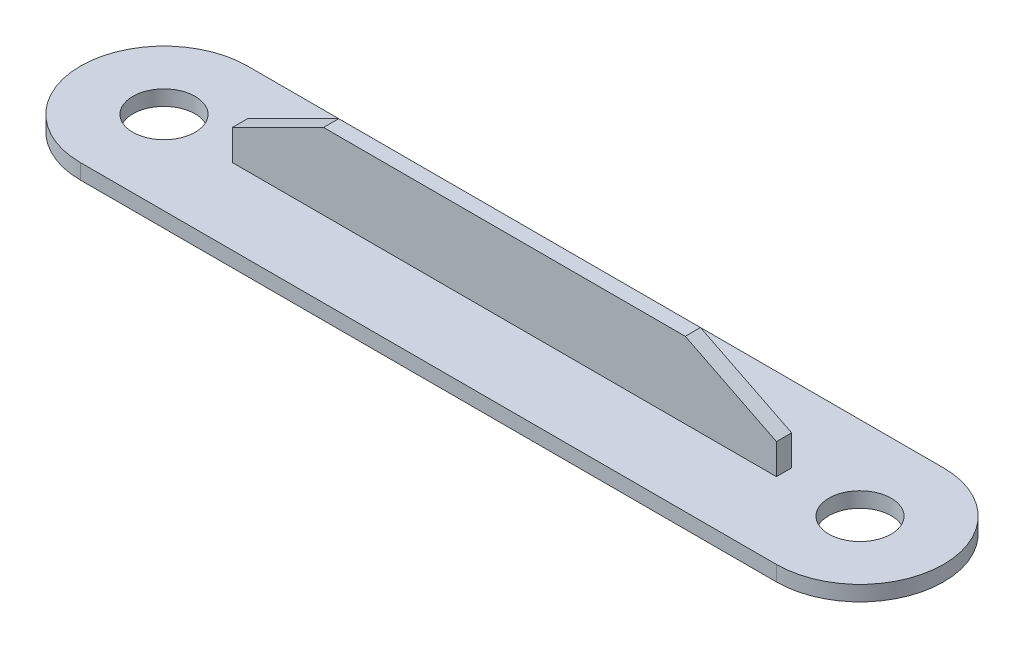
ISO-10303-21;
HEADER;
FILE_DESCRIPTION(('STEP AP214'),'2;1');
FILE_NAME('part.step','',(''),(''),'','','');
FILE_SCHEMA(('AUTOMOTIVE_DESIGN { 1 0 10303 214 1 1 1 1 }'));
ENDSEC;
DATA;
#1=APPLICATION_CONTEXT('core data for automotive mechanical design processes');
#2=APPLICATION_PROTOCOL_DEFINITION('international standard','automotive_design',2000,#1);
#3=PRODUCT_CONTEXT('',#1,'mechanical');
#4=PRODUCT('Part','Part','',(#3));
#5=PRODUCT_RELATED_PRODUCT_CATEGORY('part','',(#4));
#6=PRODUCT_DEFINITION_FORMATION('','',#4);
#7=PRODUCT_DEFINITION_CONTEXT('part definition',#1,'design');
#8=PRODUCT_DEFINITION('design','',#6,#7);
#9=PRODUCT_DEFINITION_SHAPE('','',#8);
#10=(LENGTH_UNIT() NAMED_UNIT(*) SI_UNIT(.MILLI.,.METRE.));
#11=(NAMED_UNIT(*) PLANE_ANGLE_UNIT() SI_UNIT($,.RADIAN.));
#12=(NAMED_UNIT(*) SI_UNIT($,.STERADIAN.) SOLID_ANGLE_UNIT());
#13=UNCERTAINTY_MEASURE_WITH_UNIT(LENGTH_MEASURE(1.E-05),#10,'distance_accuracy_value','');
#14=(GEOMETRIC_REPRESENTATION_CONTEXT(3) GLOBAL_UNCERTAINTY_ASSIGNED_CONTEXT((#13)) GLOBAL_UNIT_ASSIGNED_CONTEXT((#10,
#11,#12)) REPRESENTATION_CONTEXT('',''));
#15=CARTESIAN_POINT('',(0.,0.,0.));
#16=DIRECTION('',(0.,0.,1.));
#17=DIRECTION('',(1.,0.,0.));
#18=AXIS2_PLACEMENT_3D('',#15,#16,#17);
#19=CARTESIAN_POINT('',(-229.,10.,0.));
#20=DIRECTION('',(0.,1.,0.));
#21=DIRECTION('',(0.,0.,1.));
#22=AXIS2_PLACEMENT_3D('',#19,#20,#21);
#23=PLANE('',#22);
#24=CARTESIAN_POINT('',(229.,10.,0.));
#25=DIRECTION('',(0.,1.,0.));
#26=DIRECTION('',(0.,0.,1.));
#27=AXIS2_PLACEMENT_3D('',#24,#25,#26);
#28=CIRCLE('',#27,20.5);
#29=CARTESIAN_POINT('',(229.,10.,20.5));
#30=VERTEX_POINT('',#29);
#31=EDGE_CURVE('E151',#30,#30,#28,.T.);
#32=ORIENTED_EDGE('',*,*,#31,.F.);
#33=EDGE_LOOP('',(#32));
#34=FACE_BOUND('',#33,.T.);
#35=CARTESIAN_POINT('',(-229.,10.,0.));
#36=DIRECTION('',(0.,1.,0.));
#37=DIRECTION('',(0.,0.,1.));
#38=AXIS2_PLACEMENT_3D('',#35,#36,#37);
#39=CIRCLE('',#38,55.);
#40=CARTESIAN_POINT('',(-229.,10.,-55.));
#41=VERTEX_POINT('',#40);
#42=CARTESIAN_POINT('',(-229.,10.,55.));
#43=VERTEX_POINT('',#42);
#44=EDGE_CURVE('E163',#41,#43,#39,.T.);
#45=ORIENTED_EDGE('',*,*,#44,.T.);
#46=DIRECTION('',(1.,0.,0.));
#47=VECTOR('',#46,1.);
#48=CARTESIAN_POINT('',(-229.,10.,55.));
#49=LINE('',#48,#47);
#50=CARTESIAN_POINT('',(229.,10.,55.));
#51=VERTEX_POINT('',#50);
#52=EDGE_CURVE('E166',#43,#51,#49,.T.);
#53=ORIENTED_EDGE('',*,*,#52,.T.);
#54=CARTESIAN_POINT('',(229.,10.,0.));
#55=DIRECTION('',(0.,1.,0.));
#56=DIRECTION('',(0.,0.,-1.));
#57=AXIS2_PLACEMENT_3D('',#54,#55,#56);
#58=CIRCLE('',#57,55.);
#59=CARTESIAN_POINT('',(229.,10.,-55.));
#60=VERTEX_POINT('',#59);
#61=EDGE_CURVE('E169',#51,#60,#58,.T.);
#62=ORIENTED_EDGE('',*,*,#61,.T.);
#63=DIRECTION('',(-1.,0.,0.));
#64=VECTOR('',#63,1.);
#65=CARTESIAN_POINT('',(-229.,10.,-55.));
#66=LINE('',#65,#64);
#67=EDGE_CURVE('E171',#60,#41,#66,.T.);
#68=ORIENTED_EDGE('',*,*,#67,.T.);
#69=EDGE_LOOP('',(#45,#53,#62,#68));
#70=FACE_BOUND('',#69,.T.);
#71=CARTESIAN_POINT('',(-229.,10.,0.));
#72=DIRECTION('',(0.,1.,0.));
#73=DIRECTION('',(0.,0.,1.));
#74=AXIS2_PLACEMENT_3D('',#71,#72,#73);
#75=CIRCLE('',#74,20.5);
#76=CARTESIAN_POINT('',(-229.,10.,20.5));
#77=VERTEX_POINT('',#76);
#78=EDGE_CURVE('E157',#77,#77,#75,.T.);
#79=ORIENTED_EDGE('',*,*,#78,.F.);
#80=EDGE_LOOP('',(#79));
#81=FACE_BOUND('',#80,.T.);
#82=DIRECTION('',(1.,0.,0.));
#83=VECTOR('',#82,1.);
#84=CARTESIAN_POINT('',(-179.,10.,5.));
#85=LINE('',#84,#83);
#86=CARTESIAN_POINT('',(-179.,10.,5.));
#87=VERTEX_POINT('',#86);
#88=CARTESIAN_POINT('',(179.,10.,4.99999999999998));
#89=VERTEX_POINT('',#88);
#90=EDGE_CURVE('E140',#87,#89,#85,.T.);
#91=ORIENTED_EDGE('',*,*,#90,.F.);
#92=DIRECTION('',(0.,0.,1.));
#93=VECTOR('',#92,1.);
#94=CARTESIAN_POINT('',(-179.,10.,-5.));
#95=LINE('',#94,#93);
#96=CARTESIAN_POINT('',(-179.,10.,-5.));
#97=VERTEX_POINT('',#96);
#98=EDGE_CURVE('E137',#97,#87,#95,.T.);
#99=ORIENTED_EDGE('',*,*,#98,.F.);
#100=DIRECTION('',(-1.,0.,0.));
#101=VECTOR('',#100,1.);
#102=CARTESIAN_POINT('',(-179.,10.,-5.));
#103=LINE('',#102,#101);
#104=CARTESIAN_POINT('',(179.,10.,-4.99999999999998));
#105=VERTEX_POINT('',#104);
#106=EDGE_CURVE('E126',#105,#97,#103,.T.);
#107=ORIENTED_EDGE('',*,*,#106,.F.);
#108=DIRECTION('',(0.,0.,-1.));
#109=VECTOR('',#108,1.);
#110=CARTESIAN_POINT('',(179.,10.,-4.99999999999998));
#111=LINE('',#110,#109);
#112=EDGE_CURVE('E131',#89,#105,#111,.T.);
#113=ORIENTED_EDGE('',*,*,#112,.F.);
#114=EDGE_LOOP('',(#91,#99,#107,#113));
#115=FACE_BOUND('',#114,.T.);
#116=ADVANCED_FACE('F34',(#34,#70,#81,#115),#23,.T.);
#117=CARTESIAN_POINT('',(-229.,0.,0.));
#118=DIRECTION('',(0.,1.,0.));
#119=DIRECTION('',(0.,0.,1.));
#120=AXIS2_PLACEMENT_3D('',#117,#118,#119);
#121=PLANE('',#120);
#122=CARTESIAN_POINT('',(-229.,0.,0.));
#123=DIRECTION('',(0.,1.,0.));
#124=DIRECTION('',(0.,0.,1.));
#125=AXIS2_PLACEMENT_3D('',#122,#123,#124);
#126=CIRCLE('',#125,20.5);
#127=CARTESIAN_POINT('',(-229.,0.,20.5));
#128=VERTEX_POINT('',#127);
#129=EDGE_CURVE('E154',#128,#128,#126,.T.);
#130=ORIENTED_EDGE('',*,*,#129,.T.);
#131=EDGE_LOOP('',(#130));
#132=FACE_BOUND('',#131,.T.);
#133=CARTESIAN_POINT('',(-229.,0.,0.));
#134=DIRECTION('',(0.,1.,0.));
#135=DIRECTION('',(0.,0.,1.));
#136=AXIS2_PLACEMENT_3D('',#133,#134,#135);
#137=CIRCLE('',#136,55.);
#138=CARTESIAN_POINT('',(-229.,0.,-55.));
#139=VERTEX_POINT('',#138);
#140=CARTESIAN_POINT('',(-229.,0.,55.));
#141=VERTEX_POINT('',#140);
#142=EDGE_CURVE('E160',#139,#141,#137,.T.);
#143=ORIENTED_EDGE('',*,*,#142,.F.);
#144=DIRECTION('',(-1.,0.,0.));
#145=VECTOR('',#144,1.);
#146=CARTESIAN_POINT('',(-229.,0.,-55.));
#147=LINE('',#146,#145);
#148=CARTESIAN_POINT('',(229.,0.,-55.));
#149=VERTEX_POINT('',#148);
#150=EDGE_CURVE('E167',#149,#139,#147,.T.);
#151=ORIENTED_EDGE('',*,*,#150,.F.);
#152=CARTESIAN_POINT('',(229.,0.,0.));
#153=DIRECTION('',(0.,1.,0.));
#154=DIRECTION('',(0.,0.,-1.));
#155=AXIS2_PLACEMENT_3D('',#152,#153,#154);
#156=CIRCLE('',#155,55.);
#157=CARTESIAN_POINT('',(229.,0.,55.));
#158=VERTEX_POINT('',#157);
#159=EDGE_CURVE('E178',#158,#149,#156,.T.);
#160=ORIENTED_EDGE('',*,*,#159,.F.);
#161=DIRECTION('',(1.,0.,0.));
#162=VECTOR('',#161,1.);
#163=CARTESIAN_POINT('',(-229.,0.,55.));
#164=LINE('',#163,#162);
#165=EDGE_CURVE('E176',#141,#158,#164,.T.);
#166=ORIENTED_EDGE('',*,*,#165,.F.);
#167=EDGE_LOOP('',(#143,#151,#160,#166));
#168=FACE_BOUND('',#167,.T.);
#169=CARTESIAN_POINT('',(229.,0.,0.));
#170=DIRECTION('',(0.,1.,0.));
#171=DIRECTION('',(0.,0.,1.));
#172=AXIS2_PLACEMENT_3D('',#169,#170,#171);
#173=CIRCLE('',#172,20.5);
#174=CARTESIAN_POINT('',(229.,0.,20.5));
#175=VERTEX_POINT('',#174);
#176=EDGE_CURVE('E150',#175,#175,#173,.T.);
#177=ORIENTED_EDGE('',*,*,#176,.T.);
#178=EDGE_LOOP('',(#177));
#179=FACE_BOUND('',#178,.T.);
#180=ADVANCED_FACE('F224',(#132,#168,#179),#121,.F.);
#181=CARTESIAN_POINT('',(-229.,10.,0.));
#182=DIRECTION('',(0.,-1.,0.));
#183=DIRECTION('',(0.,0.,-1.));
#184=AXIS2_PLACEMENT_3D('',#181,#182,#183);
#185=CYLINDRICAL_SURFACE('',#184,55.);
#186=ORIENTED_EDGE('',*,*,#142,.T.);
#187=DIRECTION('',(0.,-1.,0.));
#188=VECTOR('',#187,1.);
#189=CARTESIAN_POINT('',(-229.,10.,55.));
#190=LINE('',#189,#188);
#191=EDGE_CURVE('E189',#43,#141,#190,.T.);
#192=ORIENTED_EDGE('',*,*,#191,.F.);
#193=ORIENTED_EDGE('',*,*,#44,.F.);
#194=DIRECTION('',(0.,-1.,0.));
#195=VECTOR('',#194,1.);
#196=CARTESIAN_POINT('',(-229.,10.,-55.));
#197=LINE('',#196,#195);
#198=EDGE_CURVE('E173',#41,#139,#197,.T.);
#199=ORIENTED_EDGE('',*,*,#198,.T.);
#200=EDGE_LOOP('',(#186,#192,#193,#199));
#201=FACE_BOUND('',#200,.T.);
#202=ADVANCED_FACE('F36',(#201),#185,.T.);
#203=CARTESIAN_POINT('',(-229.,10.,55.));
#204=DIRECTION('',(0.,0.,-1.));
#205=DIRECTION('',(-1.,0.,0.));
#206=AXIS2_PLACEMENT_3D('',#203,#204,#205);
#207=PLANE('',#206);
#208=ORIENTED_EDGE('',*,*,#165,.T.);
#209=DIRECTION('',(0.,-1.,0.));
#210=VECTOR('',#209,1.);
#211=CARTESIAN_POINT('',(229.,10.,55.));
#212=LINE('',#211,#210);
#213=EDGE_CURVE('E186',#51,#158,#212,.T.);
#214=ORIENTED_EDGE('',*,*,#213,.F.);
#215=ORIENTED_EDGE('',*,*,#52,.F.);
#216=ORIENTED_EDGE('',*,*,#191,.T.);
#217=EDGE_LOOP('',(#208,#214,#215,#216));
#218=FACE_BOUND('',#217,.T.);
#219=ADVANCED_FACE('F242',(#218),#207,.F.);
#220=CARTESIAN_POINT('',(229.,10.,0.));
#221=DIRECTION('',(0.,-1.,0.));
#222=DIRECTION('',(0.,0.,-1.));
#223=AXIS2_PLACEMENT_3D('',#220,#221,#222);
#224=CYLINDRICAL_SURFACE('',#223,55.);
#225=ORIENTED_EDGE('',*,*,#159,.T.);
#226=DIRECTION('',(0.,-1.,0.));
#227=VECTOR('',#226,1.);
#228=CARTESIAN_POINT('',(229.,10.,-55.));
#229=LINE('',#228,#227);
#230=EDGE_CURVE('E183',#60,#149,#229,.T.);
#231=ORIENTED_EDGE('',*,*,#230,.F.);
#232=ORIENTED_EDGE('',*,*,#61,.F.);
#233=ORIENTED_EDGE('',*,*,#213,.T.);
#234=EDGE_LOOP('',(#225,#231,#232,#233));
#235=FACE_BOUND('',#234,.T.);
#236=ADVANCED_FACE('F239',(#235),#224,.T.);
#237=CARTESIAN_POINT('',(-229.,10.,-55.));
#238=DIRECTION('',(0.,0.,1.));
#239=DIRECTION('',(1.,0.,0.));
#240=AXIS2_PLACEMENT_3D('',#237,#238,#239);
#241=PLANE('',#240);
#242=ORIENTED_EDGE('',*,*,#150,.T.);
#243=ORIENTED_EDGE('',*,*,#198,.F.);
#244=ORIENTED_EDGE('',*,*,#67,.F.);
#245=ORIENTED_EDGE('',*,*,#230,.T.);
#246=EDGE_LOOP('',(#242,#243,#244,#245));
#247=FACE_BOUND('',#246,.T.);
#248=ADVANCED_FACE('F236',(#247),#241,.F.);
#249=CARTESIAN_POINT('',(-229.,10.,0.));
#250=DIRECTION('',(0.,-1.,0.));
#251=DIRECTION('',(0.,0.,-1.));
#252=AXIS2_PLACEMENT_3D('',#249,#250,#251);
#253=CYLINDRICAL_SURFACE('',#252,20.5);
#254=ORIENTED_EDGE('',*,*,#78,.T.);
#255=EDGE_LOOP('',(#254));
#256=FACE_BOUND('',#255,.T.);
#257=ORIENTED_EDGE('',*,*,#129,.F.);
#258=EDGE_LOOP('',(#257));
#259=FACE_BOUND('',#258,.T.);
#260=ADVANCED_FACE('F220',(#256,#259),#253,.F.);
#261=CARTESIAN_POINT('',(229.,10.,0.));
#262=DIRECTION('',(0.,-1.,0.));
#263=DIRECTION('',(0.,0.,-1.));
#264=AXIS2_PLACEMENT_3D('',#261,#262,#263);
#265=CYLINDRICAL_SURFACE('',#264,20.5);
#266=ORIENTED_EDGE('',*,*,#31,.T.);
#267=EDGE_LOOP('',(#266));
#268=FACE_BOUND('',#267,.T.);
#269=ORIENTED_EDGE('',*,*,#176,.F.);
#270=EDGE_LOOP('',(#269));
#271=FACE_BOUND('',#270,.T.);
#272=ADVANCED_FACE('F213',(#268,#271),#265,.F.);
#273=CARTESIAN_POINT('',(-179.,60.,-5.));
#274=DIRECTION('',(1.,0.,0.));
#275=DIRECTION('',(0.,0.,-1.));
#276=AXIS2_PLACEMENT_3D('',#273,#274,#275);
#277=PLANE('',#276);
#278=DIRECTION('',(0.,-1.,0.));
#279=VECTOR('',#278,1.);
#280=CARTESIAN_POINT('',(-179.,60.,5.));
#281=LINE('',#280,#279);
#282=CARTESIAN_POINT('',(-179.,30.,4.99999999999999));
#283=VERTEX_POINT('',#282);
#284=EDGE_CURVE('E148',#283,#87,#281,.T.);
#285=ORIENTED_EDGE('',*,*,#284,.F.);
#286=DIRECTION('',(0.,0.,1.));
#287=VECTOR('',#286,1.);
#288=CARTESIAN_POINT('',(-179.,30.,-55.));
#289=LINE('',#288,#287);
#290=CARTESIAN_POINT('',(-179.,30.,-5.00000000000001));
#291=VERTEX_POINT('',#290);
#292=EDGE_CURVE('E197',#291,#283,#289,.T.);
#293=ORIENTED_EDGE('',*,*,#292,.F.);
#294=DIRECTION('',(0.,-1.,0.));
#295=VECTOR('',#294,1.);
#296=CARTESIAN_POINT('',(-179.,60.,-5.));
#297=LINE('',#296,#295);
#298=EDGE_CURVE('E128',#291,#97,#297,.T.);
#299=ORIENTED_EDGE('',*,*,#298,.T.);
#300=ORIENTED_EDGE('',*,*,#98,.T.);
#301=EDGE_LOOP('',(#285,#293,#299,#300));
#302=FACE_BOUND('',#301,.T.);
#303=ADVANCED_FACE('F211',(#302),#277,.F.);
#304=CARTESIAN_POINT('',(-179.,60.,5.));
#305=DIRECTION('',(0.,0.,-1.));
#306=DIRECTION('',(-1.,0.,0.));
#307=AXIS2_PLACEMENT_3D('',#304,#305,#306);
#308=PLANE('',#307);
#309=DIRECTION('',(0.,-1.,0.));
#310=VECTOR('',#309,1.);
#311=CARTESIAN_POINT('',(179.,60.,4.99999999999998));
#312=LINE('',#311,#310);
#313=CARTESIAN_POINT('',(179.,30.,4.99999999999999));
#314=VERTEX_POINT('',#313);
#315=EDGE_CURVE('E121',#314,#89,#312,.T.);
#316=ORIENTED_EDGE('',*,*,#315,.F.);
#317=DIRECTION('',(0.894427190999916,-0.447213595499958,0.));
#318=VECTOR('',#317,1.);
#319=CARTESIAN_POINT('',(179.,30.,4.99999999999999));
#320=LINE('',#319,#318);
#321=CARTESIAN_POINT('',(119.,60.,4.99999999999999));
#322=VERTEX_POINT('',#321);
#323=EDGE_CURVE('E110',#322,#314,#320,.T.);
#324=ORIENTED_EDGE('',*,*,#323,.F.);
#325=DIRECTION('',(1.,0.,0.));
#326=VECTOR('',#325,1.);
#327=CARTESIAN_POINT('',(-179.,60.,5.));
#328=LINE('',#327,#326);
#329=CARTESIAN_POINT('',(-119.,60.,5.));
#330=VERTEX_POINT('',#329);
#331=EDGE_CURVE('E119',#330,#322,#328,.T.);
#332=ORIENTED_EDGE('',*,*,#331,.F.);
#333=DIRECTION('',(0.894427190999916,0.447213595499958,0.));
#334=VECTOR('',#333,1.);
#335=CARTESIAN_POINT('',(-179.,30.,4.99999999999999));
#336=LINE('',#335,#334);
#337=EDGE_CURVE('E56',#283,#330,#336,.T.);
#338=ORIENTED_EDGE('',*,*,#337,.F.);
#339=ORIENTED_EDGE('',*,*,#284,.T.);
#340=ORIENTED_EDGE('',*,*,#90,.T.);
#341=EDGE_LOOP('',(#316,#324,#332,#338,#339,#340));
#342=FACE_BOUND('',#341,.T.);
#343=ADVANCED_FACE('F118',(#342),#308,.F.);
#344=CARTESIAN_POINT('',(179.,60.,-4.99999999999998));
#345=DIRECTION('',(-1.,0.,0.));
#346=DIRECTION('',(0.,0.,1.));
#347=AXIS2_PLACEMENT_3D('',#344,#345,#346);
#348=PLANE('',#347);
#349=DIRECTION('',(0.,-1.,0.));
#350=VECTOR('',#349,1.);
#351=CARTESIAN_POINT('',(179.,60.,-4.99999999999998));
#352=LINE('',#351,#350);
#353=CARTESIAN_POINT('',(179.,30.,-5.));
#354=VERTEX_POINT('',#353);
#355=EDGE_CURVE('E145',#354,#105,#352,.T.);
#356=ORIENTED_EDGE('',*,*,#355,.F.);
#357=DIRECTION('',(0.,0.,1.));
#358=VECTOR('',#357,1.);
#359=CARTESIAN_POINT('',(179.,30.,-55.));
#360=LINE('',#359,#358);
#361=EDGE_CURVE('E122',#354,#314,#360,.T.);
#362=ORIENTED_EDGE('',*,*,#361,.T.);
#363=ORIENTED_EDGE('',*,*,#315,.T.);
#364=ORIENTED_EDGE('',*,*,#112,.T.);
#365=EDGE_LOOP('',(#356,#362,#363,#364));
#366=FACE_BOUND('',#365,.T.);
#367=ADVANCED_FACE('F203',(#366),#348,.F.);
#368=CARTESIAN_POINT('',(-179.,60.,-5.));
#369=DIRECTION('',(0.,0.,1.));
#370=DIRECTION('',(1.,0.,0.));
#371=AXIS2_PLACEMENT_3D('',#368,#369,#370);
#372=PLANE('',#371);
#373=DIRECTION('',(-1.,0.,0.));
#374=VECTOR('',#373,1.);
#375=CARTESIAN_POINT('',(-179.,60.,-5.));
#376=LINE('',#375,#374);
#377=CARTESIAN_POINT('',(119.,60.,-4.99999999999998));
#378=VERTEX_POINT('',#377);
#379=CARTESIAN_POINT('',(-119.,60.,-5.00000000000001));
#380=VERTEX_POINT('',#379);
#381=EDGE_CURVE('E125',#378,#380,#376,.T.);
#382=ORIENTED_EDGE('',*,*,#381,.F.);
#383=DIRECTION('',(0.894427190999916,-0.447213595499958,0.));
#384=VECTOR('',#383,1.);
#385=CARTESIAN_POINT('',(-119.4,179.2,-5.));
#386=LINE('',#385,#384);
#387=EDGE_CURVE('E48',#378,#354,#386,.T.);
#388=ORIENTED_EDGE('',*,*,#387,.T.);
#389=ORIENTED_EDGE('',*,*,#355,.T.);
#390=ORIENTED_EDGE('',*,*,#106,.T.);
#391=ORIENTED_EDGE('',*,*,#298,.F.);
#392=DIRECTION('',(0.894427190999916,0.447213595499958,0.));
#393=VECTOR('',#392,1.);
#394=CARTESIAN_POINT('',(-167.,36.,-5.));
#395=LINE('',#394,#393);
#396=EDGE_CURVE('E134',#291,#380,#395,.T.);
#397=ORIENTED_EDGE('',*,*,#396,.T.);
#398=EDGE_LOOP('',(#382,#388,#389,#390,#391,#397));
#399=FACE_BOUND('',#398,.T.);
#400=ADVANCED_FACE('F196',(#399),#372,.F.);
#401=CARTESIAN_POINT('',(0.,60.,0.));
#402=DIRECTION('',(0.,1.,0.));
#403=DIRECTION('',(0.,0.,1.));
#404=AXIS2_PLACEMENT_3D('',#401,#402,#403);
#405=PLANE('',#404);
#406=DIRECTION('',(0.,0.,1.));
#407=VECTOR('',#406,1.);
#408=CARTESIAN_POINT('',(119.,60.,0.));
#409=LINE('',#408,#407);
#410=EDGE_CURVE('E11',#378,#322,#409,.T.);
#411=ORIENTED_EDGE('',*,*,#410,.F.);
#412=ORIENTED_EDGE('',*,*,#381,.T.);
#413=DIRECTION('',(0.,0.,-1.));
#414=VECTOR('',#413,1.);
#415=CARTESIAN_POINT('',(-119.,60.,0.));
#416=LINE('',#415,#414);
#417=EDGE_CURVE('E42',#330,#380,#416,.T.);
#418=ORIENTED_EDGE('',*,*,#417,.F.);
#419=ORIENTED_EDGE('',*,*,#331,.T.);
#420=EDGE_LOOP('',(#411,#412,#418,#419));
#421=FACE_BOUND('',#420,.T.);
#422=ADVANCED_FACE('F124',(#421),#405,.T.);
#423=CARTESIAN_POINT('',(-179.,30.,-55.));
#424=DIRECTION('',(0.447213595499958,-0.894427190999916,0.));
#425=DIRECTION('',(0.894427190999916,0.447213595499958,0.));
#426=AXIS2_PLACEMENT_3D('',#423,#424,#425);
#427=PLANE('',#426);
#428=ORIENTED_EDGE('',*,*,#292,.T.);
#429=ORIENTED_EDGE('',*,*,#337,.T.);
#430=ORIENTED_EDGE('',*,*,#417,.T.);
#431=ORIENTED_EDGE('',*,*,#396,.F.);
#432=EDGE_LOOP('',(#428,#429,#430,#431));
#433=FACE_BOUND('',#432,.T.);
#434=ADVANCED_FACE('F192',(#433),#427,.F.);
#435=CARTESIAN_POINT('',(179.,30.,-55.));
#436=DIRECTION('',(-0.447213595499958,-0.894427190999916,0.));
#437=DIRECTION('',(0.894427190999916,-0.447213595499958,0.));
#438=AXIS2_PLACEMENT_3D('',#435,#436,#437);
#439=PLANE('',#438);
#440=ORIENTED_EDGE('',*,*,#410,.T.);
#441=ORIENTED_EDGE('',*,*,#323,.T.);
#442=ORIENTED_EDGE('',*,*,#361,.F.);
#443=ORIENTED_EDGE('',*,*,#387,.F.);
#444=EDGE_LOOP('',(#440,#441,#442,#443));
#445=FACE_BOUND('',#444,.T.);
#446=ADVANCED_FACE('F109',(#445),#439,.F.);
#447=CLOSED_SHELL('',(#116,#180,#202,#219,#236,#248,#260,#272,#303,#343,#367,#400,#422,#434,#446));
#448=MANIFOLD_SOLID_BREP('B2',#447);
#449=ADVANCED_BREP_SHAPE_REPRESENTATION('',(#18,#448),#14);
#450=SHAPE_DEFINITION_REPRESENTATION(#9,#449);
ENDSEC;
END-ISO-10303-21;
